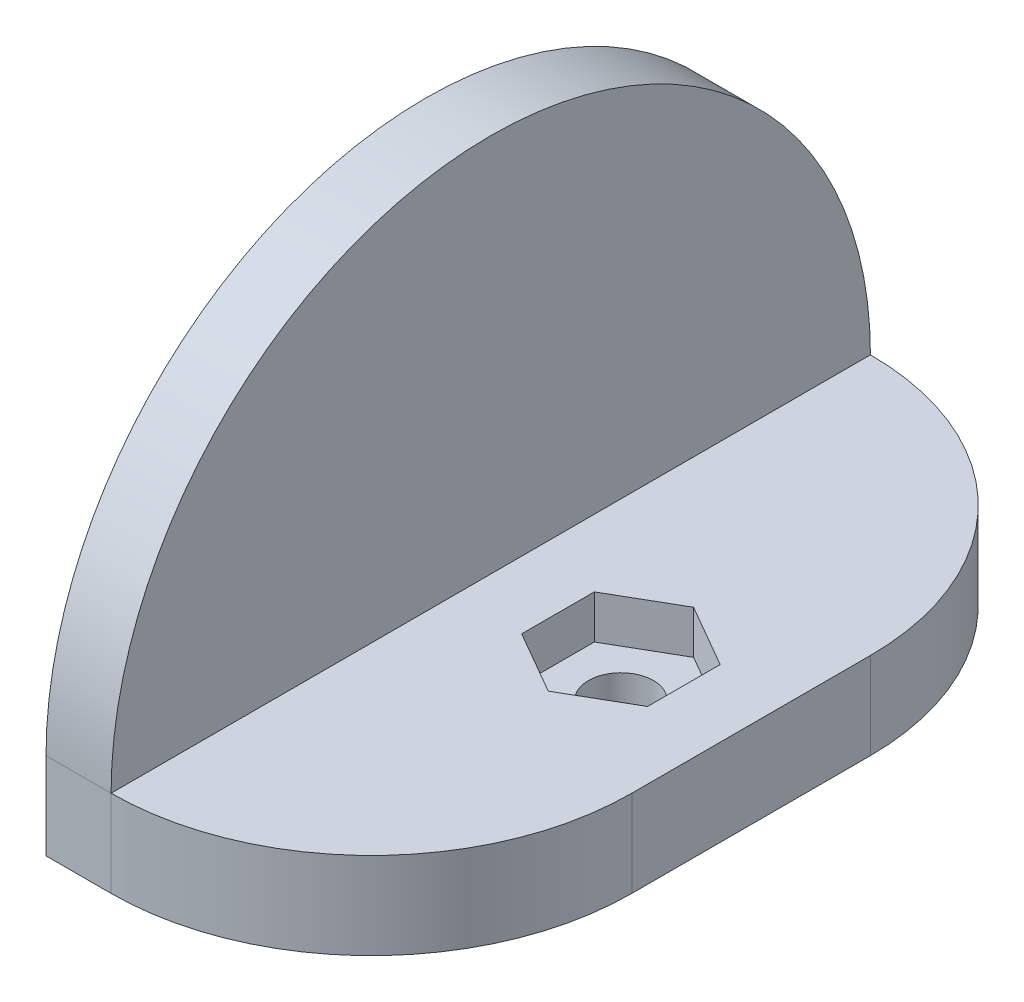
ISO-10303-21;
HEADER;
FILE_DESCRIPTION(('STEP AP214'),'2;1');
FILE_NAME('part.step','',(''),(''),'','','');
FILE_SCHEMA(('AUTOMOTIVE_DESIGN { 1 0 10303 214 1 1 1 1 }'));
ENDSEC;
DATA;
#1=APPLICATION_CONTEXT('core data for automotive mechanical design processes');
#2=APPLICATION_PROTOCOL_DEFINITION('international standard','automotive_design',2000,#1);
#3=PRODUCT_CONTEXT('',#1,'mechanical');
#4=PRODUCT('Part','Part','',(#3));
#5=PRODUCT_RELATED_PRODUCT_CATEGORY('part','',(#4));
#6=PRODUCT_DEFINITION_FORMATION('','',#4);
#7=PRODUCT_DEFINITION_CONTEXT('part definition',#1,'design');
#8=PRODUCT_DEFINITION('design','',#6,#7);
#9=PRODUCT_DEFINITION_SHAPE('','',#8);
#10=(LENGTH_UNIT() NAMED_UNIT(*) SI_UNIT(.MILLI.,.METRE.));
#11=(NAMED_UNIT(*) PLANE_ANGLE_UNIT() SI_UNIT($,.RADIAN.));
#12=(NAMED_UNIT(*) SI_UNIT($,.STERADIAN.) SOLID_ANGLE_UNIT());
#13=UNCERTAINTY_MEASURE_WITH_UNIT(LENGTH_MEASURE(1.E-05),#10,'distance_accuracy_value','');
#14=(GEOMETRIC_REPRESENTATION_CONTEXT(3) GLOBAL_UNCERTAINTY_ASSIGNED_CONTEXT((#13)) GLOBAL_UNIT_ASSIGNED_CONTEXT((#10,
#11,#12)) REPRESENTATION_CONTEXT('',''));
#15=CARTESIAN_POINT('',(0.,0.,0.));
#16=DIRECTION('',(0.,0.,1.));
#17=DIRECTION('',(1.,0.,0.));
#18=AXIS2_PLACEMENT_3D('',#15,#16,#17);
#19=CARTESIAN_POINT('',(15.,4.,35.));
#20=DIRECTION('',(-1.,0.,0.));
#21=DIRECTION('',(0.,-1.,0.));
#22=AXIS2_PLACEMENT_3D('',#19,#20,#21);
#23=PLANE('',#22);
#24=DIRECTION('',(0.,1.,0.));
#25=VECTOR('',#24,1.);
#26=CARTESIAN_POINT('',(15.,-6.,12.));
#27=LINE('',#26,#25);
#28=CARTESIAN_POINT('',(15.,0.,12.));
#29=VERTEX_POINT('',#28);
#30=CARTESIAN_POINT('',(15.,4.,12.));
#31=VERTEX_POINT('',#30);
#32=EDGE_CURVE('E148',#29,#31,#27,.T.);
#33=ORIENTED_EDGE('',*,*,#32,.T.);
#34=DIRECTION('',(0.,0.,-1.));
#35=VECTOR('',#34,1.);
#36=CARTESIAN_POINT('',(15.,4.,35.));
#37=LINE('',#36,#35);
#38=CARTESIAN_POINT('',(15.,4.,23.));
#39=VERTEX_POINT('',#38);
#40=EDGE_CURVE('E157',#39,#31,#37,.T.);
#41=ORIENTED_EDGE('',*,*,#40,.F.);
#42=DIRECTION('',(0.,1.,0.));
#43=VECTOR('',#42,1.);
#44=CARTESIAN_POINT('',(15.,-6.,23.));
#45=LINE('',#44,#43);
#46=CARTESIAN_POINT('',(15.,0.,23.));
#47=VERTEX_POINT('',#46);
#48=EDGE_CURVE('E144',#47,#39,#45,.T.);
#49=ORIENTED_EDGE('',*,*,#48,.F.);
#50=DIRECTION('',(0.,0.,-1.));
#51=VECTOR('',#50,1.);
#52=CARTESIAN_POINT('',(15.,0.,35.));
#53=LINE('',#52,#51);
#54=EDGE_CURVE('E159',#47,#29,#53,.T.);
#55=ORIENTED_EDGE('',*,*,#54,.T.);
#56=EDGE_LOOP('',(#33,#41,#49,#55));
#57=FACE_BOUND('',#56,.T.);
#58=ADVANCED_FACE('F31',(#57),#23,.F.);
#59=CARTESIAN_POINT('',(0.,23.,35.));
#60=DIRECTION('',(0.,0.,-1.));
#61=DIRECTION('',(-1.,0.,0.));
#62=AXIS2_PLACEMENT_3D('',#59,#60,#61);
#63=PLANE('',#62);
#64=DIRECTION('',(0.,1.,0.));
#65=VECTOR('',#64,1.);
#66=CARTESIAN_POINT('',(3.,-6.,35.));
#67=LINE('',#66,#65);
#68=CARTESIAN_POINT('',(3.,4.,35.));
#69=VERTEX_POINT('',#68);
#70=CARTESIAN_POINT('',(3.,0.,35.));
#71=VERTEX_POINT('',#70);
#72=EDGE_CURVE('E11',#69,#71,#67,.F.);
#73=ORIENTED_EDGE('',*,*,#72,.F.);
#74=DIRECTION('',(1.,0.,0.));
#75=VECTOR('',#74,1.);
#76=CARTESIAN_POINT('',(-7.,4.,35.));
#77=LINE('',#76,#75);
#78=CARTESIAN_POINT('',(0.,4.,35.));
#79=VERTEX_POINT('',#78);
#80=EDGE_CURVE('E119',#79,#69,#77,.T.);
#81=ORIENTED_EDGE('',*,*,#80,.F.);
#82=DIRECTION('',(0.,-1.,0.));
#83=VECTOR('',#82,1.);
#84=CARTESIAN_POINT('',(0.,0.,35.));
#85=LINE('',#84,#83);
#86=CARTESIAN_POINT('',(0.,0.,35.));
#87=VERTEX_POINT('',#86);
#88=EDGE_CURVE('E161',#79,#87,#85,.T.);
#89=ORIENTED_EDGE('',*,*,#88,.T.);
#90=DIRECTION('',(1.,0.,0.));
#91=VECTOR('',#90,1.);
#92=CARTESIAN_POINT('',(15.,0.,35.));
#93=LINE('',#92,#91);
#94=EDGE_CURVE('E154',#87,#71,#93,.T.);
#95=ORIENTED_EDGE('',*,*,#94,.T.);
#96=EDGE_LOOP('',(#73,#81,#89,#95));
#97=FACE_BOUND('',#96,.T.);
#98=ADVANCED_FACE('F152',(#97),#63,.F.);
#99=CARTESIAN_POINT('',(0.,0.,35.));
#100=DIRECTION('',(1.,0.,0.));
#101=DIRECTION('',(0.,0.,-1.));
#102=AXIS2_PLACEMENT_3D('',#99,#100,#101);
#103=PLANE('',#102);
#104=ORIENTED_EDGE('',*,*,#88,.F.);
#105=CARTESIAN_POINT('',(0.,4.,17.5));
#106=DIRECTION('',(1.,0.,0.));
#107=DIRECTION('',(0.,0.,-1.));
#108=AXIS2_PLACEMENT_3D('',#105,#106,#107);
#109=CIRCLE('',#108,17.5);
#110=CARTESIAN_POINT('',(0.,4.,0.));
#111=VERTEX_POINT('',#110);
#112=EDGE_CURVE('E125',#79,#111,#109,.F.);
#113=ORIENTED_EDGE('',*,*,#112,.T.);
#114=DIRECTION('',(0.,-1.,0.));
#115=VECTOR('',#114,1.);
#116=CARTESIAN_POINT('',(0.,0.,0.));
#117=LINE('',#116,#115);
#118=CARTESIAN_POINT('',(0.,0.,0.));
#119=VERTEX_POINT('',#118);
#120=EDGE_CURVE('E182',#111,#119,#117,.T.);
#121=ORIENTED_EDGE('',*,*,#120,.T.);
#122=DIRECTION('',(0.,0.,-1.));
#123=VECTOR('',#122,1.);
#124=CARTESIAN_POINT('',(0.,0.,35.));
#125=LINE('',#124,#123);
#126=EDGE_CURVE('E169',#87,#119,#125,.T.);
#127=ORIENTED_EDGE('',*,*,#126,.F.);
#128=EDGE_LOOP('',(#104,#113,#121,#127));
#129=FACE_BOUND('',#128,.T.);
#130=ADVANCED_FACE('F33',(#129),#103,.F.);
#131=CARTESIAN_POINT('',(15.,0.,35.));
#132=DIRECTION('',(0.,1.,0.));
#133=DIRECTION('',(-1.,0.,0.));
#134=AXIS2_PLACEMENT_3D('',#131,#132,#133);
#135=PLANE('',#134);
#136=CARTESIAN_POINT('',(8.99999999999999,0.,17.5));
#137=DIRECTION('',(0.,1.,0.));
#138=DIRECTION('',(-1.,0.,0.));
#139=AXIS2_PLACEMENT_3D('',#136,#137,#138);
#140=CIRCLE('',#139,1.5);
#141=CARTESIAN_POINT('',(7.49999999999999,0.,17.5));
#142=VERTEX_POINT('',#141);
#143=EDGE_CURVE('E216',#142,#142,#140,.T.);
#144=ORIENTED_EDGE('',*,*,#143,.T.);
#145=EDGE_LOOP('',(#144));
#146=FACE_BOUND('',#145,.T.);
#147=DIRECTION('',(1.,0.,0.));
#148=VECTOR('',#147,1.);
#149=CARTESIAN_POINT('',(15.,0.,0.));
#150=LINE('',#149,#148);
#151=CARTESIAN_POINT('',(3.,0.,0.));
#152=VERTEX_POINT('',#151);
#153=EDGE_CURVE('E164',#119,#152,#150,.T.);
#154=ORIENTED_EDGE('',*,*,#153,.T.);
#155=CARTESIAN_POINT('',(3.,0.,12.));
#156=DIRECTION('',(0.,1.,0.));
#157=DIRECTION('',(-1.,0.,0.));
#158=AXIS2_PLACEMENT_3D('',#155,#156,#157);
#159=CIRCLE('',#158,12.);
#160=EDGE_CURVE('E46',#152,#29,#159,.F.);
#161=ORIENTED_EDGE('',*,*,#160,.T.);
#162=ORIENTED_EDGE('',*,*,#54,.F.);
#163=CARTESIAN_POINT('',(3.,0.,23.));
#164=DIRECTION('',(0.,1.,0.));
#165=DIRECTION('',(-1.,0.,0.));
#166=AXIS2_PLACEMENT_3D('',#163,#164,#165);
#167=CIRCLE('',#166,12.);
#168=EDGE_CURVE('E238',#47,#71,#167,.F.);
#169=ORIENTED_EDGE('',*,*,#168,.T.);
#170=ORIENTED_EDGE('',*,*,#94,.F.);
#171=ORIENTED_EDGE('',*,*,#126,.T.);
#172=EDGE_LOOP('',(#154,#161,#162,#169,#170,#171));
#173=FACE_BOUND('',#172,.T.);
#174=ADVANCED_FACE('F179',(#146,#173),#135,.F.);
#175=CARTESIAN_POINT('',(3.,4.,35.));
#176=DIRECTION('',(0.,-1.,0.));
#177=DIRECTION('',(1.,0.,0.));
#178=AXIS2_PLACEMENT_3D('',#175,#176,#177);
#179=PLANE('',#178);
#180=DIRECTION('',(-0.866025403784439,0.,0.5));
#181=VECTOR('',#180,1.);
#182=CARTESIAN_POINT('',(9.,4.,14.1513684387002));
#183=LINE('',#182,#181);
#184=CARTESIAN_POINT('',(9.,4.,14.1513684387002));
#185=VERTEX_POINT('',#184);
#186=CARTESIAN_POINT('',(6.1,4.,15.8256842193501));
#187=VERTEX_POINT('',#186);
#188=EDGE_CURVE('E212',#185,#187,#183,.T.);
#189=ORIENTED_EDGE('',*,*,#188,.F.);
#190=DIRECTION('',(-0.866025403784439,0.,-0.5));
#191=VECTOR('',#190,1.);
#192=CARTESIAN_POINT('',(11.9,4.,15.8256842193501));
#193=LINE('',#192,#191);
#194=CARTESIAN_POINT('',(11.9,4.,15.8256842193501));
#195=VERTEX_POINT('',#194);
#196=EDGE_CURVE('E54',#195,#185,#193,.T.);
#197=ORIENTED_EDGE('',*,*,#196,.F.);
#198=DIRECTION('',(0.,0.,-1.));
#199=VECTOR('',#198,1.);
#200=CARTESIAN_POINT('',(11.9,4.,19.1743157806499));
#201=LINE('',#200,#199);
#202=CARTESIAN_POINT('',(11.9,4.,19.1743157806499));
#203=VERTEX_POINT('',#202);
#204=EDGE_CURVE('E199',#203,#195,#201,.T.);
#205=ORIENTED_EDGE('',*,*,#204,.F.);
#206=DIRECTION('',(0.866025403784439,0.,-0.5));
#207=VECTOR('',#206,1.);
#208=CARTESIAN_POINT('',(9.,4.,20.8486315612998));
#209=LINE('',#208,#207);
#210=CARTESIAN_POINT('',(9.,4.,20.8486315612998));
#211=VERTEX_POINT('',#210);
#212=EDGE_CURVE('E203',#211,#203,#209,.T.);
#213=ORIENTED_EDGE('',*,*,#212,.F.);
#214=DIRECTION('',(0.866025403784438,0.,0.5));
#215=VECTOR('',#214,1.);
#216=CARTESIAN_POINT('',(6.1,4.,19.1743157806499));
#217=LINE('',#216,#215);
#218=CARTESIAN_POINT('',(6.1,4.,19.1743157806499));
#219=VERTEX_POINT('',#218);
#220=EDGE_CURVE('E206',#219,#211,#217,.T.);
#221=ORIENTED_EDGE('',*,*,#220,.F.);
#222=DIRECTION('',(0.,0.,1.));
#223=VECTOR('',#222,1.);
#224=CARTESIAN_POINT('',(6.1,4.,15.8256842193501));
#225=LINE('',#224,#223);
#226=EDGE_CURVE('E209',#187,#219,#225,.T.);
#227=ORIENTED_EDGE('',*,*,#226,.F.);
#228=EDGE_LOOP('',(#189,#197,#205,#213,#221,#227));
#229=FACE_BOUND('',#228,.T.);
#230=ORIENTED_EDGE('',*,*,#40,.T.);
#231=CARTESIAN_POINT('',(3.,4.,12.));
#232=DIRECTION('',(0.,-1.,0.));
#233=DIRECTION('',(1.,0.,0.));
#234=AXIS2_PLACEMENT_3D('',#231,#232,#233);
#235=CIRCLE('',#234,12.);
#236=CARTESIAN_POINT('',(3.,4.,0.));
#237=VERTEX_POINT('',#236);
#238=EDGE_CURVE('E149',#237,#31,#235,.T.);
#239=ORIENTED_EDGE('',*,*,#238,.F.);
#240=DIRECTION('',(0.,0.,-1.));
#241=VECTOR('',#240,1.);
#242=CARTESIAN_POINT('',(3.,4.,35.));
#243=LINE('',#242,#241);
#244=EDGE_CURVE('E136',#69,#237,#243,.T.);
#245=ORIENTED_EDGE('',*,*,#244,.F.);
#246=CARTESIAN_POINT('',(3.,4.,23.));
#247=DIRECTION('',(0.,-1.,0.));
#248=DIRECTION('',(-1.,0.,0.));
#249=AXIS2_PLACEMENT_3D('',#246,#247,#248);
#250=CIRCLE('',#249,12.);
#251=EDGE_CURVE('E140',#39,#69,#250,.T.);
#252=ORIENTED_EDGE('',*,*,#251,.F.);
#253=EDGE_LOOP('',(#230,#239,#245,#252));
#254=FACE_BOUND('',#253,.T.);
#255=ADVANCED_FACE('F156',(#229,#254),#179,.F.);
#256=CARTESIAN_POINT('',(3.,23.,35.));
#257=DIRECTION('',(-1.,0.,0.));
#258=DIRECTION('',(0.,-1.,0.));
#259=AXIS2_PLACEMENT_3D('',#256,#257,#258);
#260=PLANE('',#259);
#261=ORIENTED_EDGE('',*,*,#244,.T.);
#262=CARTESIAN_POINT('',(3.,4.,17.5));
#263=DIRECTION('',(-1.,0.,0.));
#264=DIRECTION('',(0.,1.,0.));
#265=AXIS2_PLACEMENT_3D('',#262,#263,#264);
#266=CIRCLE('',#265,17.5);
#267=EDGE_CURVE('E122',#69,#237,#266,.T.);
#268=ORIENTED_EDGE('',*,*,#267,.F.);
#269=EDGE_LOOP('',(#261,#268));
#270=FACE_BOUND('',#269,.T.);
#271=ADVANCED_FACE('F134',(#270),#260,.F.);
#272=CARTESIAN_POINT('',(0.,23.,0.));
#273=DIRECTION('',(0.,0.,-1.));
#274=DIRECTION('',(-1.,0.,0.));
#275=AXIS2_PLACEMENT_3D('',#272,#273,#274);
#276=PLANE('',#275);
#277=DIRECTION('',(1.,0.,0.));
#278=VECTOR('',#277,1.);
#279=CARTESIAN_POINT('',(-7.,4.,0.));
#280=LINE('',#279,#278);
#281=EDGE_CURVE('E129',#111,#237,#280,.T.);
#282=ORIENTED_EDGE('',*,*,#281,.T.);
#283=DIRECTION('',(0.,1.,0.));
#284=VECTOR('',#283,1.);
#285=CARTESIAN_POINT('',(3.,23.,0.));
#286=LINE('',#285,#284);
#287=EDGE_CURVE('E39',#152,#237,#286,.T.);
#288=ORIENTED_EDGE('',*,*,#287,.F.);
#289=ORIENTED_EDGE('',*,*,#153,.F.);
#290=ORIENTED_EDGE('',*,*,#120,.F.);
#291=EDGE_LOOP('',(#282,#288,#289,#290));
#292=FACE_BOUND('',#291,.T.);
#293=ADVANCED_FACE('F176',(#292),#276,.T.);
#294=CARTESIAN_POINT('',(11.9,2.,15.8256842193501));
#295=DIRECTION('',(0.5,0.,-0.866025403784439));
#296=DIRECTION('',(-0.866025403784439,0.,-0.5));
#297=AXIS2_PLACEMENT_3D('',#294,#295,#296);
#298=PLANE('',#297);
#299=ORIENTED_EDGE('',*,*,#196,.T.);
#300=DIRECTION('',(0.,1.,0.));
#301=VECTOR('',#300,1.);
#302=CARTESIAN_POINT('',(9.,2.,14.1513684387002));
#303=LINE('',#302,#301);
#304=CARTESIAN_POINT('',(9.,2.,14.1513684387002));
#305=VERTEX_POINT('',#304);
#306=EDGE_CURVE('E189',#305,#185,#303,.T.);
#307=ORIENTED_EDGE('',*,*,#306,.F.);
#308=DIRECTION('',(-0.866025403784439,0.,-0.5));
#309=VECTOR('',#308,1.);
#310=CARTESIAN_POINT('',(11.9,2.,15.8256842193501));
#311=LINE('',#310,#309);
#312=CARTESIAN_POINT('',(11.9,2.,15.8256842193501));
#313=VERTEX_POINT('',#312);
#314=EDGE_CURVE('E202',#313,#305,#311,.T.);
#315=ORIENTED_EDGE('',*,*,#314,.F.);
#316=DIRECTION('',(0.,1.,0.));
#317=VECTOR('',#316,1.);
#318=CARTESIAN_POINT('',(11.9,2.,15.8256842193501));
#319=LINE('',#318,#317);
#320=EDGE_CURVE('E184',#313,#195,#319,.T.);
#321=ORIENTED_EDGE('',*,*,#320,.T.);
#322=EDGE_LOOP('',(#299,#307,#315,#321));
#323=FACE_BOUND('',#322,.T.);
#324=ADVANCED_FACE('F282',(#323),#298,.F.);
#325=CARTESIAN_POINT('',(11.9,2.,19.1743157806499));
#326=DIRECTION('',(1.,0.,0.));
#327=DIRECTION('',(0.,0.,-1.));
#328=AXIS2_PLACEMENT_3D('',#325,#326,#327);
#329=PLANE('',#328);
#330=ORIENTED_EDGE('',*,*,#204,.T.);
#331=ORIENTED_EDGE('',*,*,#320,.F.);
#332=DIRECTION('',(0.,0.,-1.));
#333=VECTOR('',#332,1.);
#334=CARTESIAN_POINT('',(11.9,2.,19.1743157806499));
#335=LINE('',#334,#333);
#336=CARTESIAN_POINT('',(11.9,2.,19.1743157806499));
#337=VERTEX_POINT('',#336);
#338=EDGE_CURVE('E192',#337,#313,#335,.T.);
#339=ORIENTED_EDGE('',*,*,#338,.F.);
#340=DIRECTION('',(0.,1.,0.));
#341=VECTOR('',#340,1.);
#342=CARTESIAN_POINT('',(11.9,2.,19.1743157806499));
#343=LINE('',#342,#341);
#344=EDGE_CURVE('E186',#337,#203,#343,.T.);
#345=ORIENTED_EDGE('',*,*,#344,.T.);
#346=EDGE_LOOP('',(#330,#331,#339,#345));
#347=FACE_BOUND('',#346,.T.);
#348=ADVANCED_FACE('F278',(#347),#329,.F.);
#349=CARTESIAN_POINT('',(9.,2.,20.8486315612998));
#350=DIRECTION('',(0.5,0.,0.866025403784439));
#351=DIRECTION('',(0.866025403784439,0.,-0.5));
#352=AXIS2_PLACEMENT_3D('',#349,#350,#351);
#353=PLANE('',#352);
#354=ORIENTED_EDGE('',*,*,#212,.T.);
#355=ORIENTED_EDGE('',*,*,#344,.F.);
#356=DIRECTION('',(0.866025403784439,0.,-0.5));
#357=VECTOR('',#356,1.);
#358=CARTESIAN_POINT('',(9.,2.,20.8486315612998));
#359=LINE('',#358,#357);
#360=CARTESIAN_POINT('',(9.,2.,20.8486315612998));
#361=VERTEX_POINT('',#360);
#362=EDGE_CURVE('E219',#361,#337,#359,.T.);
#363=ORIENTED_EDGE('',*,*,#362,.F.);
#364=DIRECTION('',(0.,1.,0.));
#365=VECTOR('',#364,1.);
#366=CARTESIAN_POINT('',(9.,2.,20.8486315612998));
#367=LINE('',#366,#365);
#368=EDGE_CURVE('E196',#361,#211,#367,.T.);
#369=ORIENTED_EDGE('',*,*,#368,.T.);
#370=EDGE_LOOP('',(#354,#355,#363,#369));
#371=FACE_BOUND('',#370,.T.);
#372=ADVANCED_FACE('F281',(#371),#353,.F.);
#373=CARTESIAN_POINT('',(6.1,2.,19.1743157806499));
#374=DIRECTION('',(-0.5,0.,0.866025403784439));
#375=DIRECTION('',(0.866025403784439,0.,0.5));
#376=AXIS2_PLACEMENT_3D('',#373,#374,#375);
#377=PLANE('',#376);
#378=ORIENTED_EDGE('',*,*,#220,.T.);
#379=ORIENTED_EDGE('',*,*,#368,.F.);
#380=DIRECTION('',(0.866025403784438,0.,0.5));
#381=VECTOR('',#380,1.);
#382=CARTESIAN_POINT('',(6.1,2.,19.1743157806499));
#383=LINE('',#382,#381);
#384=CARTESIAN_POINT('',(6.1,2.,19.1743157806499));
#385=VERTEX_POINT('',#384);
#386=EDGE_CURVE('E222',#385,#361,#383,.T.);
#387=ORIENTED_EDGE('',*,*,#386,.F.);
#388=DIRECTION('',(0.,1.,0.));
#389=VECTOR('',#388,1.);
#390=CARTESIAN_POINT('',(6.1,2.,19.1743157806499));
#391=LINE('',#390,#389);
#392=EDGE_CURVE('E194',#385,#219,#391,.T.);
#393=ORIENTED_EDGE('',*,*,#392,.T.);
#394=EDGE_LOOP('',(#378,#379,#387,#393));
#395=FACE_BOUND('',#394,.T.);
#396=ADVANCED_FACE('F286',(#395),#377,.F.);
#397=CARTESIAN_POINT('',(6.1,2.,15.8256842193501));
#398=DIRECTION('',(-1.,0.,0.));
#399=DIRECTION('',(0.,-1.,0.));
#400=AXIS2_PLACEMENT_3D('',#397,#398,#399);
#401=PLANE('',#400);
#402=ORIENTED_EDGE('',*,*,#226,.T.);
#403=ORIENTED_EDGE('',*,*,#392,.F.);
#404=DIRECTION('',(0.,0.,1.));
#405=VECTOR('',#404,1.);
#406=CARTESIAN_POINT('',(6.1,2.,15.8256842193501));
#407=LINE('',#406,#405);
#408=CARTESIAN_POINT('',(6.1,2.,15.8256842193501));
#409=VERTEX_POINT('',#408);
#410=EDGE_CURVE('E225',#409,#385,#407,.T.);
#411=ORIENTED_EDGE('',*,*,#410,.F.);
#412=DIRECTION('',(0.,1.,0.));
#413=VECTOR('',#412,1.);
#414=CARTESIAN_POINT('',(6.1,2.,15.8256842193501));
#415=LINE('',#414,#413);
#416=EDGE_CURVE('E191',#409,#187,#415,.T.);
#417=ORIENTED_EDGE('',*,*,#416,.T.);
#418=EDGE_LOOP('',(#402,#403,#411,#417));
#419=FACE_BOUND('',#418,.T.);
#420=ADVANCED_FACE('F290',(#419),#401,.F.);
#421=CARTESIAN_POINT('',(9.,2.,14.1513684387002));
#422=DIRECTION('',(-0.5,0.,-0.866025403784439));
#423=DIRECTION('',(-0.866025403784439,0.,0.5));
#424=AXIS2_PLACEMENT_3D('',#421,#422,#423);
#425=PLANE('',#424);
#426=ORIENTED_EDGE('',*,*,#188,.T.);
#427=ORIENTED_EDGE('',*,*,#416,.F.);
#428=DIRECTION('',(-0.866025403784439,0.,0.5));
#429=VECTOR('',#428,1.);
#430=CARTESIAN_POINT('',(9.,2.,14.1513684387002));
#431=LINE('',#430,#429);
#432=EDGE_CURVE('E228',#305,#409,#431,.T.);
#433=ORIENTED_EDGE('',*,*,#432,.F.);
#434=ORIENTED_EDGE('',*,*,#306,.T.);
#435=EDGE_LOOP('',(#426,#427,#433,#434));
#436=FACE_BOUND('',#435,.T.);
#437=ADVANCED_FACE('F273',(#436),#425,.F.);
#438=CARTESIAN_POINT('',(9.,2.,14.1513684387002));
#439=DIRECTION('',(0.,1.,0.));
#440=DIRECTION('',(0.,0.,1.));
#441=AXIS2_PLACEMENT_3D('',#438,#439,#440);
#442=PLANE('',#441);
#443=CARTESIAN_POINT('',(8.99999999999999,2.,17.5));
#444=DIRECTION('',(0.,1.,0.));
#445=DIRECTION('',(0.,0.,1.));
#446=AXIS2_PLACEMENT_3D('',#443,#444,#445);
#447=CIRCLE('',#446,1.5);
#448=CARTESIAN_POINT('',(8.99999999999999,2.,19.));
#449=VERTEX_POINT('',#448);
#450=EDGE_CURVE('E235',#449,#449,#447,.T.);
#451=ORIENTED_EDGE('',*,*,#450,.F.);
#452=EDGE_LOOP('',(#451));
#453=FACE_BOUND('',#452,.T.);
#454=ORIENTED_EDGE('',*,*,#314,.T.);
#455=ORIENTED_EDGE('',*,*,#432,.T.);
#456=ORIENTED_EDGE('',*,*,#410,.T.);
#457=ORIENTED_EDGE('',*,*,#386,.T.);
#458=ORIENTED_EDGE('',*,*,#362,.T.);
#459=ORIENTED_EDGE('',*,*,#338,.T.);
#460=EDGE_LOOP('',(#454,#455,#456,#457,#458,#459));
#461=FACE_BOUND('',#460,.T.);
#462=ADVANCED_FACE('F265',(#453,#461),#442,.T.);
#463=CARTESIAN_POINT('',(8.99999999999999,-8.,17.5));
#464=DIRECTION('',(0.,1.,0.));
#465=DIRECTION('',(0.,0.,1.));
#466=AXIS2_PLACEMENT_3D('',#463,#464,#465);
#467=CYLINDRICAL_SURFACE('',#466,1.5);
#468=ORIENTED_EDGE('',*,*,#450,.T.);
#469=EDGE_LOOP('',(#468));
#470=FACE_BOUND('',#469,.T.);
#471=ORIENTED_EDGE('',*,*,#143,.F.);
#472=EDGE_LOOP('',(#471));
#473=FACE_BOUND('',#472,.T.);
#474=ADVANCED_FACE('F263',(#470,#473),#467,.F.);
#475=CARTESIAN_POINT('',(3.,-6.,12.));
#476=DIRECTION('',(0.,1.,0.));
#477=DIRECTION('',(-1.,0.,0.));
#478=AXIS2_PLACEMENT_3D('',#475,#476,#477);
#479=CYLINDRICAL_SURFACE('',#478,12.);
#480=ORIENTED_EDGE('',*,*,#287,.T.);
#481=ORIENTED_EDGE('',*,*,#238,.T.);
#482=ORIENTED_EDGE('',*,*,#32,.F.);
#483=ORIENTED_EDGE('',*,*,#160,.F.);
#484=EDGE_LOOP('',(#480,#481,#482,#483));
#485=FACE_BOUND('',#484,.T.);
#486=ADVANCED_FACE('F171',(#485),#479,.T.);
#487=CARTESIAN_POINT('',(3.,-6.,23.));
#488=DIRECTION('',(0.,1.,0.));
#489=DIRECTION('',(-1.,0.,0.));
#490=AXIS2_PLACEMENT_3D('',#487,#488,#489);
#491=CYLINDRICAL_SURFACE('',#490,12.);
#492=ORIENTED_EDGE('',*,*,#48,.T.);
#493=ORIENTED_EDGE('',*,*,#251,.T.);
#494=ORIENTED_EDGE('',*,*,#72,.T.);
#495=ORIENTED_EDGE('',*,*,#168,.F.);
#496=EDGE_LOOP('',(#492,#493,#494,#495));
#497=FACE_BOUND('',#496,.T.);
#498=ADVANCED_FACE('F141',(#497),#491,.T.);
#499=CARTESIAN_POINT('',(-7.,4.,17.5));
#500=DIRECTION('',(1.,0.,0.));
#501=DIRECTION('',(0.,1.,0.));
#502=AXIS2_PLACEMENT_3D('',#499,#500,#501);
#503=CYLINDRICAL_SURFACE('',#502,17.5);
#504=ORIENTED_EDGE('',*,*,#80,.T.);
#505=ORIENTED_EDGE('',*,*,#267,.T.);
#506=ORIENTED_EDGE('',*,*,#281,.F.);
#507=ORIENTED_EDGE('',*,*,#112,.F.);
#508=EDGE_LOOP('',(#504,#505,#506,#507));
#509=FACE_BOUND('',#508,.T.);
#510=ADVANCED_FACE('F121',(#509),#503,.T.);
#511=CLOSED_SHELL('',(#58,#98,#130,#174,#255,#271,#293,#324,#348,#372,#396,#420,#437,#462,#474,
#486,#498,#510));
#512=MANIFOLD_SOLID_BREP('B2',#511);
#513=ADVANCED_BREP_SHAPE_REPRESENTATION('',(#18,#512),#14);
#514=SHAPE_DEFINITION_REPRESENTATION(#9,#513);
ENDSEC;
END-ISO-10303-21;
